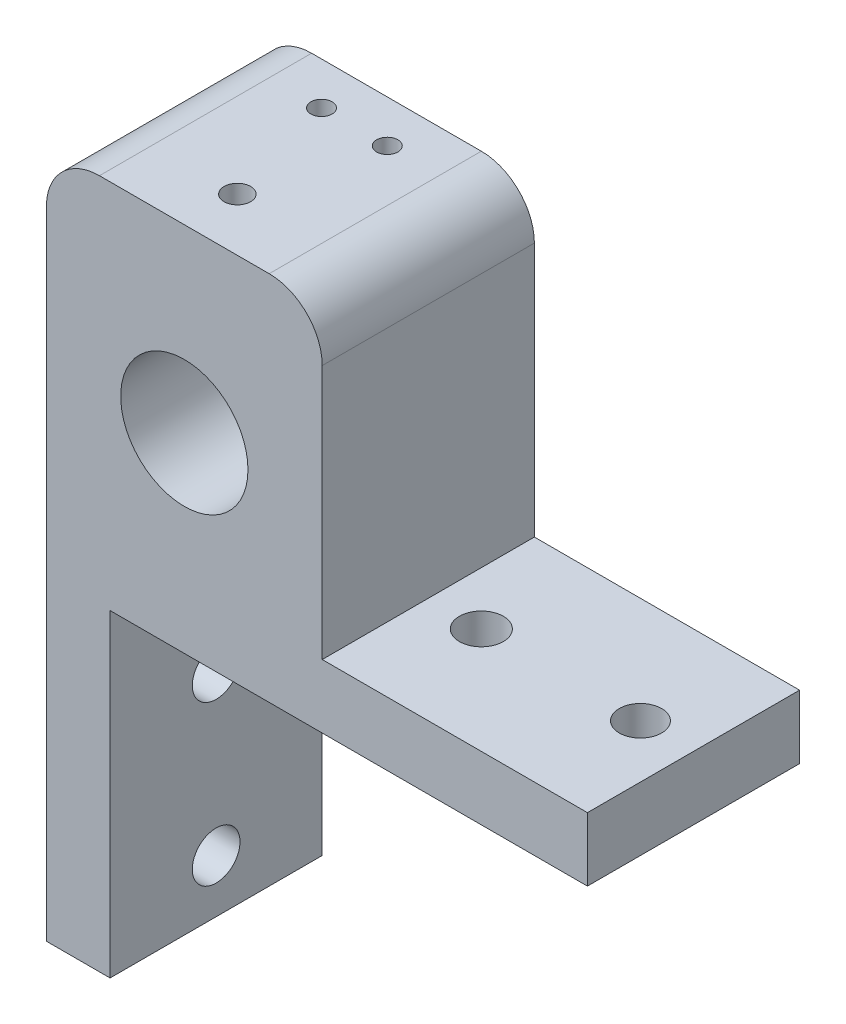
ISO-10303-21;
HEADER;
FILE_DESCRIPTION(('STEP AP214'),'2;1');
FILE_NAME('part.step','',(''),(''),'','','');
FILE_SCHEMA(('AUTOMOTIVE_DESIGN { 1 0 10303 214 1 1 1 1 }'));
ENDSEC;
DATA;
#1=APPLICATION_CONTEXT('core data for automotive mechanical design processes');
#2=APPLICATION_PROTOCOL_DEFINITION('international standard','automotive_design',2000,#1);
#3=PRODUCT_CONTEXT('',#1,'mechanical');
#4=PRODUCT('Part','Part','',(#3));
#5=PRODUCT_RELATED_PRODUCT_CATEGORY('part','',(#4));
#6=PRODUCT_DEFINITION_FORMATION('','',#4);
#7=PRODUCT_DEFINITION_CONTEXT('part definition',#1,'design');
#8=PRODUCT_DEFINITION('design','',#6,#7);
#9=PRODUCT_DEFINITION_SHAPE('','',#8);
#10=(LENGTH_UNIT() NAMED_UNIT(*) SI_UNIT(.MILLI.,.METRE.));
#11=(NAMED_UNIT(*) PLANE_ANGLE_UNIT() SI_UNIT($,.RADIAN.));
#12=(NAMED_UNIT(*) SI_UNIT($,.STERADIAN.) SOLID_ANGLE_UNIT());
#13=UNCERTAINTY_MEASURE_WITH_UNIT(LENGTH_MEASURE(1.E-05),#10,'distance_accuracy_value','');
#14=(GEOMETRIC_REPRESENTATION_CONTEXT(3) GLOBAL_UNCERTAINTY_ASSIGNED_CONTEXT((#13)) GLOBAL_UNIT_ASSIGNED_CONTEXT((#10,
#11,#12)) REPRESENTATION_CONTEXT('',''));
#15=CARTESIAN_POINT('',(0.,0.,0.));
#16=DIRECTION('',(0.,0.,1.));
#17=DIRECTION('',(1.,0.,0.));
#18=AXIS2_PLACEMENT_3D('',#15,#16,#17);
#19=CARTESIAN_POINT('',(0.,0.,-20.));
#20=DIRECTION('',(0.,0.,-1.));
#21=DIRECTION('',(1.,0.,0.));
#22=AXIS2_PLACEMENT_3D('',#19,#20,#21);
#23=PLANE('',#22);
#24=DIRECTION('',(-1.,0.,0.));
#25=VECTOR('',#24,1.);
#26=CARTESIAN_POINT('',(-13.,22.,-20.));
#27=LINE('',#26,#25);
#28=CARTESIAN_POINT('',(7.99999999999999,22.,-20.));
#29=VERTEX_POINT('',#28);
#30=CARTESIAN_POINT('',(-8.,22.,-20.));
#31=VERTEX_POINT('',#30);
#32=EDGE_CURVE('E146',#29,#31,#27,.T.);
#33=ORIENTED_EDGE('',*,*,#32,.F.);
#34=CARTESIAN_POINT('',(8.,17.,-20.));
#35=DIRECTION('',(0.,0.,1.));
#36=DIRECTION('',(1.,0.,0.));
#37=AXIS2_PLACEMENT_3D('',#34,#35,#36);
#38=CIRCLE('',#37,5.);
#39=CARTESIAN_POINT('',(13.,17.,-20.));
#40=VERTEX_POINT('',#39);
#41=EDGE_CURVE('E210',#40,#29,#38,.T.);
#42=ORIENTED_EDGE('',*,*,#41,.F.);
#43=DIRECTION('',(0.,1.,0.));
#44=VECTOR('',#43,1.);
#45=CARTESIAN_POINT('',(13.,22.,-20.));
#46=LINE('',#45,#44);
#47=CARTESIAN_POINT('',(13.,-7.,-20.));
#48=VERTEX_POINT('',#47);
#49=EDGE_CURVE('E141',#48,#40,#46,.T.);
#50=ORIENTED_EDGE('',*,*,#49,.F.);
#51=DIRECTION('',(-1.,0.,0.));
#52=VECTOR('',#51,1.);
#53=CARTESIAN_POINT('',(13.,-7.,-20.));
#54=LINE('',#53,#52);
#55=CARTESIAN_POINT('',(38.,-7.,-20.));
#56=VERTEX_POINT('',#55);
#57=EDGE_CURVE('E139',#56,#48,#54,.T.);
#58=ORIENTED_EDGE('',*,*,#57,.F.);
#59=DIRECTION('',(0.,1.,0.));
#60=VECTOR('',#59,1.);
#61=CARTESIAN_POINT('',(38.,-13.,-20.));
#62=LINE('',#61,#60);
#63=CARTESIAN_POINT('',(38.,-13.,-20.));
#64=VERTEX_POINT('',#63);
#65=EDGE_CURVE('E116',#64,#56,#62,.T.);
#66=ORIENTED_EDGE('',*,*,#65,.F.);
#67=DIRECTION('',(1.,0.,0.));
#68=VECTOR('',#67,1.);
#69=CARTESIAN_POINT('',(13.,-13.,-20.));
#70=LINE('',#69,#68);
#71=CARTESIAN_POINT('',(-7.,-13.,-20.));
#72=VERTEX_POINT('',#71);
#73=EDGE_CURVE('E127',#72,#64,#70,.T.);
#74=ORIENTED_EDGE('',*,*,#73,.F.);
#75=DIRECTION('',(0.,1.,0.));
#76=VECTOR('',#75,1.);
#77=CARTESIAN_POINT('',(-7.,-13.,-20.));
#78=LINE('',#77,#76);
#79=CARTESIAN_POINT('',(-6.99999999999999,-43.,-20.));
#80=VERTEX_POINT('',#79);
#81=EDGE_CURVE('E155',#80,#72,#78,.T.);
#82=ORIENTED_EDGE('',*,*,#81,.F.);
#83=DIRECTION('',(1.,0.,0.));
#84=VECTOR('',#83,1.);
#85=CARTESIAN_POINT('',(-13.,-43.,-20.));
#86=LINE('',#85,#84);
#87=CARTESIAN_POINT('',(-13.,-43.,-20.));
#88=VERTEX_POINT('',#87);
#89=EDGE_CURVE('E152',#88,#80,#86,.T.);
#90=ORIENTED_EDGE('',*,*,#89,.F.);
#91=DIRECTION('',(0.,-1.,0.));
#92=VECTOR('',#91,1.);
#93=CARTESIAN_POINT('',(-13.,22.,-20.));
#94=LINE('',#93,#92);
#95=CARTESIAN_POINT('',(-13.,17.,-20.));
#96=VERTEX_POINT('',#95);
#97=EDGE_CURVE('E149',#96,#88,#94,.T.);
#98=ORIENTED_EDGE('',*,*,#97,.F.);
#99=CARTESIAN_POINT('',(-8.,17.,-20.));
#100=DIRECTION('',(0.,0.,1.));
#101=DIRECTION('',(1.,0.,0.));
#102=AXIS2_PLACEMENT_3D('',#99,#100,#101);
#103=CIRCLE('',#102,5.);
#104=EDGE_CURVE('E43',#31,#96,#103,.T.);
#105=ORIENTED_EDGE('',*,*,#104,.F.);
#106=EDGE_LOOP('',(#33,#42,#50,#58,#66,#74,#82,#90,#98,#105));
#107=FACE_BOUND('',#106,.T.);
#108=CARTESIAN_POINT('',(0.,5.,-20.));
#109=DIRECTION('',(0.,0.,1.));
#110=DIRECTION('',(1.,0.,0.));
#111=AXIS2_PLACEMENT_3D('',#108,#109,#110);
#112=CIRCLE('',#111,6.);
#113=CARTESIAN_POINT('',(6.,5.,-20.));
#114=VERTEX_POINT('',#113);
#115=EDGE_CURVE('E159',#114,#114,#112,.T.);
#116=ORIENTED_EDGE('',*,*,#115,.T.);
#117=EDGE_LOOP('',(#116));
#118=FACE_BOUND('',#117,.T.);
#119=ADVANCED_FACE('F35',(#107,#118),#23,.T.);
#120=CARTESIAN_POINT('',(0.,0.,0.));
#121=DIRECTION('',(0.,0.,-1.));
#122=DIRECTION('',(1.,0.,0.));
#123=AXIS2_PLACEMENT_3D('',#120,#121,#122);
#124=PLANE('',#123);
#125=DIRECTION('',(0.,-1.,0.));
#126=VECTOR('',#125,1.);
#127=CARTESIAN_POINT('',(-13.,-3.99999999999999,0.));
#128=LINE('',#127,#126);
#129=CARTESIAN_POINT('',(-13.,17.,0.));
#130=VERTEX_POINT('',#129);
#131=CARTESIAN_POINT('',(-13.,-43.,0.));
#132=VERTEX_POINT('',#131);
#133=EDGE_CURVE('E168',#130,#132,#128,.T.);
#134=ORIENTED_EDGE('',*,*,#133,.T.);
#135=DIRECTION('',(1.,0.,0.));
#136=VECTOR('',#135,1.);
#137=CARTESIAN_POINT('',(-13.,-43.,0.));
#138=LINE('',#137,#136);
#139=CARTESIAN_POINT('',(-6.99999999999999,-43.,0.));
#140=VERTEX_POINT('',#139);
#141=EDGE_CURVE('E171',#132,#140,#138,.T.);
#142=ORIENTED_EDGE('',*,*,#141,.T.);
#143=DIRECTION('',(0.,1.,0.));
#144=VECTOR('',#143,1.);
#145=CARTESIAN_POINT('',(-7.,-13.,0.));
#146=LINE('',#145,#144);
#147=CARTESIAN_POINT('',(-7.,-13.,0.));
#148=VERTEX_POINT('',#147);
#149=EDGE_CURVE('E174',#140,#148,#146,.T.);
#150=ORIENTED_EDGE('',*,*,#149,.T.);
#151=DIRECTION('',(1.,0.,0.));
#152=VECTOR('',#151,1.);
#153=CARTESIAN_POINT('',(-7.,-13.,0.));
#154=LINE('',#153,#152);
#155=CARTESIAN_POINT('',(38.,-13.,0.));
#156=VERTEX_POINT('',#155);
#157=EDGE_CURVE('E133',#148,#156,#154,.T.);
#158=ORIENTED_EDGE('',*,*,#157,.T.);
#159=DIRECTION('',(0.,1.,0.));
#160=VECTOR('',#159,1.);
#161=CARTESIAN_POINT('',(38.,-13.,0.));
#162=LINE('',#161,#160);
#163=CARTESIAN_POINT('',(38.,-7.,0.));
#164=VERTEX_POINT('',#163);
#165=EDGE_CURVE('E119',#156,#164,#162,.T.);
#166=ORIENTED_EDGE('',*,*,#165,.T.);
#167=DIRECTION('',(-1.,0.,0.));
#168=VECTOR('',#167,1.);
#169=CARTESIAN_POINT('',(13.,-7.,0.));
#170=LINE('',#169,#168);
#171=CARTESIAN_POINT('',(13.,-7.,0.));
#172=VERTEX_POINT('',#171);
#173=EDGE_CURVE('E158',#164,#172,#170,.T.);
#174=ORIENTED_EDGE('',*,*,#173,.T.);
#175=DIRECTION('',(0.,1.,0.));
#176=VECTOR('',#175,1.);
#177=CARTESIAN_POINT('',(13.,22.,0.));
#178=LINE('',#177,#176);
#179=CARTESIAN_POINT('',(13.,17.,0.));
#180=VERTEX_POINT('',#179);
#181=EDGE_CURVE('E162',#172,#180,#178,.T.);
#182=ORIENTED_EDGE('',*,*,#181,.T.);
#183=CARTESIAN_POINT('',(8.,17.,0.));
#184=DIRECTION('',(0.,0.,1.));
#185=DIRECTION('',(1.,0.,0.));
#186=AXIS2_PLACEMENT_3D('',#183,#184,#185);
#187=CIRCLE('',#186,5.);
#188=CARTESIAN_POINT('',(7.99999999999999,22.,0.));
#189=VERTEX_POINT('',#188);
#190=EDGE_CURVE('E203',#189,#180,#187,.F.);
#191=ORIENTED_EDGE('',*,*,#190,.F.);
#192=DIRECTION('',(-1.,0.,0.));
#193=VECTOR('',#192,1.);
#194=CARTESIAN_POINT('',(-13.,22.,0.));
#195=LINE('',#194,#193);
#196=CARTESIAN_POINT('',(-8.,22.,0.));
#197=VERTEX_POINT('',#196);
#198=EDGE_CURVE('E165',#189,#197,#195,.T.);
#199=ORIENTED_EDGE('',*,*,#198,.T.);
#200=CARTESIAN_POINT('',(-8.,17.,0.));
#201=DIRECTION('',(0.,0.,1.));
#202=DIRECTION('',(1.,0.,0.));
#203=AXIS2_PLACEMENT_3D('',#200,#201,#202);
#204=CIRCLE('',#203,5.);
#205=EDGE_CURVE('E205',#130,#197,#204,.F.);
#206=ORIENTED_EDGE('',*,*,#205,.F.);
#207=EDGE_LOOP('',(#134,#142,#150,#158,#166,#174,#182,#191,#199,#206));
#208=FACE_BOUND('',#207,.T.);
#209=CARTESIAN_POINT('',(0.,5.,0.));
#210=DIRECTION('',(0.,0.,1.));
#211=DIRECTION('',(1.,0.,0.));
#212=AXIS2_PLACEMENT_3D('',#209,#210,#211);
#213=CIRCLE('',#212,6.);
#214=CARTESIAN_POINT('',(6.,5.,0.));
#215=VERTEX_POINT('',#214);
#216=EDGE_CURVE('E193',#215,#215,#213,.T.);
#217=ORIENTED_EDGE('',*,*,#216,.F.);
#218=EDGE_LOOP('',(#217));
#219=FACE_BOUND('',#218,.T.);
#220=ADVANCED_FACE('F220',(#208,#219),#124,.F.);
#221=CARTESIAN_POINT('',(38.,-13.,-20.));
#222=DIRECTION('',(-1.,0.,0.));
#223=DIRECTION('',(0.,-1.,0.));
#224=AXIS2_PLACEMENT_3D('',#221,#222,#223);
#225=PLANE('',#224);
#226=ORIENTED_EDGE('',*,*,#165,.F.);
#227=DIRECTION('',(0.,0.,1.));
#228=VECTOR('',#227,1.);
#229=CARTESIAN_POINT('',(38.,-13.,-20.));
#230=LINE('',#229,#228);
#231=EDGE_CURVE('E112',#64,#156,#230,.T.);
#232=ORIENTED_EDGE('',*,*,#231,.F.);
#233=ORIENTED_EDGE('',*,*,#65,.T.);
#234=DIRECTION('',(0.,0.,1.));
#235=VECTOR('',#234,1.);
#236=CARTESIAN_POINT('',(38.,-7.,-20.));
#237=LINE('',#236,#235);
#238=EDGE_CURVE('E124',#56,#164,#237,.T.);
#239=ORIENTED_EDGE('',*,*,#238,.T.);
#240=EDGE_LOOP('',(#226,#232,#233,#239));
#241=FACE_BOUND('',#240,.T.);
#242=ADVANCED_FACE('F114',(#241),#225,.F.);
#243=CARTESIAN_POINT('',(13.,-7.,-20.));
#244=DIRECTION('',(0.,-1.,0.));
#245=DIRECTION('',(0.,0.,1.));
#246=AXIS2_PLACEMENT_3D('',#243,#244,#245);
#247=PLANE('',#246);
#248=CARTESIAN_POINT('',(33.,-7.,-10.));
#249=DIRECTION('',(0.,-1.,0.));
#250=DIRECTION('',(0.,0.,-1.));
#251=AXIS2_PLACEMENT_3D('',#248,#249,#250);
#252=CIRCLE('',#251,2.);
#253=CARTESIAN_POINT('',(33.,-7.,-12.));
#254=VERTEX_POINT('',#253);
#255=EDGE_CURVE('E198',#254,#254,#252,.T.);
#256=ORIENTED_EDGE('',*,*,#255,.T.);
#257=EDGE_LOOP('',(#256));
#258=FACE_BOUND('',#257,.T.);
#259=CARTESIAN_POINT('',(18.,-7.,-10.));
#260=DIRECTION('',(0.,-1.,0.));
#261=DIRECTION('',(0.,0.,-1.));
#262=AXIS2_PLACEMENT_3D('',#259,#260,#261);
#263=CIRCLE('',#262,2.07036437574447);
#264=CARTESIAN_POINT('',(18.,-7.,-12.0703643757445));
#265=VERTEX_POINT('',#264);
#266=EDGE_CURVE('E306',#265,#265,#263,.T.);
#267=ORIENTED_EDGE('',*,*,#266,.T.);
#268=EDGE_LOOP('',(#267));
#269=FACE_BOUND('',#268,.T.);
#270=ORIENTED_EDGE('',*,*,#173,.F.);
#271=ORIENTED_EDGE('',*,*,#238,.F.);
#272=ORIENTED_EDGE('',*,*,#57,.T.);
#273=DIRECTION('',(0.,0.,1.));
#274=VECTOR('',#273,1.);
#275=CARTESIAN_POINT('',(13.,-7.,-20.));
#276=LINE('',#275,#274);
#277=EDGE_CURVE('E183',#48,#172,#276,.T.);
#278=ORIENTED_EDGE('',*,*,#277,.T.);
#279=EDGE_LOOP('',(#270,#271,#272,#278));
#280=FACE_BOUND('',#279,.T.);
#281=ADVANCED_FACE('F232',(#258,#269,#280),#247,.F.);
#282=CARTESIAN_POINT('',(13.,22.,-20.));
#283=DIRECTION('',(-1.,0.,0.));
#284=DIRECTION('',(0.,-1.,0.));
#285=AXIS2_PLACEMENT_3D('',#282,#283,#284);
#286=PLANE('',#285);
#287=ORIENTED_EDGE('',*,*,#181,.F.);
#288=ORIENTED_EDGE('',*,*,#277,.F.);
#289=ORIENTED_EDGE('',*,*,#49,.T.);
#290=DIRECTION('',(0.,0.,1.));
#291=VECTOR('',#290,1.);
#292=CARTESIAN_POINT('',(13.,17.,-20.));
#293=LINE('',#292,#291);
#294=EDGE_CURVE('E11',#180,#40,#293,.F.);
#295=ORIENTED_EDGE('',*,*,#294,.F.);
#296=EDGE_LOOP('',(#287,#288,#289,#295));
#297=FACE_BOUND('',#296,.T.);
#298=ADVANCED_FACE('F230',(#297),#286,.F.);
#299=CARTESIAN_POINT('',(-13.,22.,-20.));
#300=DIRECTION('',(0.,-1.,0.));
#301=DIRECTION('',(0.,0.,1.));
#302=AXIS2_PLACEMENT_3D('',#299,#300,#301);
#303=PLANE('',#302);
#304=CARTESIAN_POINT('',(3.13217874254306,22.,-16.));
#305=DIRECTION('',(0.,-1.,0.));
#306=DIRECTION('',(0.,0.,-1.));
#307=AXIS2_PLACEMENT_3D('',#304,#305,#306);
#308=CIRCLE('',#307,1.);
#309=CARTESIAN_POINT('',(3.13217874254306,22.,-17.));
#310=VERTEX_POINT('',#309);
#311=EDGE_CURVE('E406',#310,#310,#308,.T.);
#312=ORIENTED_EDGE('',*,*,#311,.T.);
#313=EDGE_LOOP('',(#312));
#314=FACE_BOUND('',#313,.T.);
#315=CARTESIAN_POINT('',(-3.06782125745694,22.,-16.));
#316=DIRECTION('',(0.,-1.,0.));
#317=DIRECTION('',(0.,0.,-1.));
#318=AXIS2_PLACEMENT_3D('',#315,#316,#317);
#319=CIRCLE('',#318,1.);
#320=CARTESIAN_POINT('',(-3.06782125745694,22.,-17.));
#321=VERTEX_POINT('',#320);
#322=EDGE_CURVE('E412',#321,#321,#319,.T.);
#323=ORIENTED_EDGE('',*,*,#322,.T.);
#324=EDGE_LOOP('',(#323));
#325=FACE_BOUND('',#324,.T.);
#326=CARTESIAN_POINT('',(0.,22.,-5.));
#327=DIRECTION('',(0.,-1.,0.));
#328=DIRECTION('',(0.,0.,-1.));
#329=AXIS2_PLACEMENT_3D('',#326,#327,#328);
#330=CIRCLE('',#329,1.25);
#331=CARTESIAN_POINT('',(0.,22.,-6.25));
#332=VERTEX_POINT('',#331);
#333=EDGE_CURVE('E309',#332,#332,#330,.T.);
#334=ORIENTED_EDGE('',*,*,#333,.T.);
#335=EDGE_LOOP('',(#334));
#336=FACE_BOUND('',#335,.T.);
#337=ORIENTED_EDGE('',*,*,#198,.F.);
#338=DIRECTION('',(0.,0.,1.));
#339=VECTOR('',#338,1.);
#340=CARTESIAN_POINT('',(8.,22.,-20.));
#341=LINE('',#340,#339);
#342=EDGE_CURVE('E207',#29,#189,#341,.T.);
#343=ORIENTED_EDGE('',*,*,#342,.F.);
#344=ORIENTED_EDGE('',*,*,#32,.T.);
#345=DIRECTION('',(0.,0.,1.));
#346=VECTOR('',#345,1.);
#347=CARTESIAN_POINT('',(-8.,22.,-20.));
#348=LINE('',#347,#346);
#349=EDGE_CURVE('E56',#197,#31,#348,.F.);
#350=ORIENTED_EDGE('',*,*,#349,.F.);
#351=EDGE_LOOP('',(#337,#343,#344,#350));
#352=FACE_BOUND('',#351,.T.);
#353=ADVANCED_FACE('F225',(#314,#325,#336,#352),#303,.F.);
#354=CARTESIAN_POINT('',(-13.,-3.99999999999999,-20.));
#355=DIRECTION('',(1.,0.,0.));
#356=DIRECTION('',(0.,1.,0.));
#357=AXIS2_PLACEMENT_3D('',#354,#355,#356);
#358=PLANE('',#357);
#359=CARTESIAN_POINT('',(-13.,-38.,-10.));
#360=DIRECTION('',(1.,0.,0.));
#361=DIRECTION('',(0.,-1.,0.));
#362=AXIS2_PLACEMENT_3D('',#359,#360,#361);
#363=CIRCLE('',#362,2.25);
#364=CARTESIAN_POINT('',(-13.,-40.25,-10.));
#365=VERTEX_POINT('',#364);
#366=EDGE_CURVE('E190',#365,#365,#363,.T.);
#367=ORIENTED_EDGE('',*,*,#366,.T.);
#368=EDGE_LOOP('',(#367));
#369=FACE_BOUND('',#368,.T.);
#370=CARTESIAN_POINT('',(-13.,-23.,-10.));
#371=DIRECTION('',(1.,0.,0.));
#372=DIRECTION('',(0.,-1.,0.));
#373=AXIS2_PLACEMENT_3D('',#370,#371,#372);
#374=CIRCLE('',#373,2.25);
#375=CARTESIAN_POINT('',(-13.,-25.25,-10.));
#376=VERTEX_POINT('',#375);
#377=EDGE_CURVE('E201',#376,#376,#374,.T.);
#378=ORIENTED_EDGE('',*,*,#377,.T.);
#379=EDGE_LOOP('',(#378));
#380=FACE_BOUND('',#379,.T.);
#381=ORIENTED_EDGE('',*,*,#97,.T.);
#382=DIRECTION('',(0.,0.,1.));
#383=VECTOR('',#382,1.);
#384=CARTESIAN_POINT('',(-13.,-43.,-20.));
#385=LINE('',#384,#383);
#386=EDGE_CURVE('E181',#88,#132,#385,.T.);
#387=ORIENTED_EDGE('',*,*,#386,.T.);
#388=ORIENTED_EDGE('',*,*,#133,.F.);
#389=DIRECTION('',(0.,0.,1.));
#390=VECTOR('',#389,1.);
#391=CARTESIAN_POINT('',(-13.,17.,-20.));
#392=LINE('',#391,#390);
#393=EDGE_CURVE('E123',#96,#130,#392,.T.);
#394=ORIENTED_EDGE('',*,*,#393,.F.);
#395=EDGE_LOOP('',(#381,#387,#388,#394));
#396=FACE_BOUND('',#395,.T.);
#397=ADVANCED_FACE('F216',(#369,#380,#396),#358,.F.);
#398=CARTESIAN_POINT('',(-13.,-43.,-20.));
#399=DIRECTION('',(0.,1.,0.));
#400=DIRECTION('',(0.,0.,-1.));
#401=AXIS2_PLACEMENT_3D('',#398,#399,#400);
#402=PLANE('',#401);
#403=ORIENTED_EDGE('',*,*,#141,.F.);
#404=ORIENTED_EDGE('',*,*,#386,.F.);
#405=ORIENTED_EDGE('',*,*,#89,.T.);
#406=DIRECTION('',(0.,0.,1.));
#407=VECTOR('',#406,1.);
#408=CARTESIAN_POINT('',(-6.99999999999999,-43.,-20.));
#409=LINE('',#408,#407);
#410=EDGE_CURVE('E179',#80,#140,#409,.T.);
#411=ORIENTED_EDGE('',*,*,#410,.T.);
#412=EDGE_LOOP('',(#403,#404,#405,#411));
#413=FACE_BOUND('',#412,.T.);
#414=ADVANCED_FACE('F237',(#413),#402,.F.);
#415=CARTESIAN_POINT('',(-7.,-13.,-20.));
#416=DIRECTION('',(-1.,0.,0.));
#417=DIRECTION('',(0.,-1.,0.));
#418=AXIS2_PLACEMENT_3D('',#415,#416,#417);
#419=PLANE('',#418);
#420=CARTESIAN_POINT('',(-6.99999999999999,-38.,-10.));
#421=DIRECTION('',(1.,0.,0.));
#422=DIRECTION('',(0.,-1.,0.));
#423=AXIS2_PLACEMENT_3D('',#420,#421,#422);
#424=CIRCLE('',#423,2.25);
#425=CARTESIAN_POINT('',(-6.99999999999999,-40.25,-10.));
#426=VERTEX_POINT('',#425);
#427=EDGE_CURVE('E189',#426,#426,#424,.T.);
#428=ORIENTED_EDGE('',*,*,#427,.F.);
#429=EDGE_LOOP('',(#428));
#430=FACE_BOUND('',#429,.T.);
#431=CARTESIAN_POINT('',(-7.,-23.,-10.));
#432=DIRECTION('',(1.,0.,0.));
#433=DIRECTION('',(0.,-1.,0.));
#434=AXIS2_PLACEMENT_3D('',#431,#432,#433);
#435=CIRCLE('',#434,2.25);
#436=CARTESIAN_POINT('',(-7.,-25.25,-10.));
#437=VERTEX_POINT('',#436);
#438=EDGE_CURVE('E186',#437,#437,#435,.T.);
#439=ORIENTED_EDGE('',*,*,#438,.F.);
#440=EDGE_LOOP('',(#439));
#441=FACE_BOUND('',#440,.T.);
#442=ORIENTED_EDGE('',*,*,#149,.F.);
#443=ORIENTED_EDGE('',*,*,#410,.F.);
#444=ORIENTED_EDGE('',*,*,#81,.T.);
#445=DIRECTION('',(0.,0.,1.));
#446=VECTOR('',#445,1.);
#447=CARTESIAN_POINT('',(-7.,-13.,-20.));
#448=LINE('',#447,#446);
#449=EDGE_CURVE('E129',#72,#148,#448,.T.);
#450=ORIENTED_EDGE('',*,*,#449,.T.);
#451=EDGE_LOOP('',(#442,#443,#444,#450));
#452=FACE_BOUND('',#451,.T.);
#453=ADVANCED_FACE('F235',(#430,#441,#452),#419,.F.);
#454=CARTESIAN_POINT('',(-7.,-13.,-20.));
#455=DIRECTION('',(0.,1.,0.));
#456=DIRECTION('',(0.,0.,-1.));
#457=AXIS2_PLACEMENT_3D('',#454,#455,#456);
#458=PLANE('',#457);
#459=CARTESIAN_POINT('',(33.,-13.,-10.));
#460=DIRECTION('',(0.,-1.,0.));
#461=DIRECTION('',(0.,0.,-1.));
#462=AXIS2_PLACEMENT_3D('',#459,#460,#461);
#463=CIRCLE('',#462,2.);
#464=CARTESIAN_POINT('',(33.,-13.,-12.));
#465=VERTEX_POINT('',#464);
#466=EDGE_CURVE('E197',#465,#465,#463,.T.);
#467=ORIENTED_EDGE('',*,*,#466,.F.);
#468=EDGE_LOOP('',(#467));
#469=FACE_BOUND('',#468,.T.);
#470=CARTESIAN_POINT('',(18.,-13.,-10.));
#471=DIRECTION('',(0.,-1.,0.));
#472=DIRECTION('',(0.,0.,-1.));
#473=AXIS2_PLACEMENT_3D('',#470,#471,#472);
#474=CIRCLE('',#473,2.07036437574447);
#475=CARTESIAN_POINT('',(18.,-13.,-12.0703643757445));
#476=VERTEX_POINT('',#475);
#477=EDGE_CURVE('E194',#476,#476,#474,.T.);
#478=ORIENTED_EDGE('',*,*,#477,.F.);
#479=EDGE_LOOP('',(#478));
#480=FACE_BOUND('',#479,.T.);
#481=ORIENTED_EDGE('',*,*,#157,.F.);
#482=ORIENTED_EDGE('',*,*,#449,.F.);
#483=ORIENTED_EDGE('',*,*,#73,.T.);
#484=ORIENTED_EDGE('',*,*,#231,.T.);
#485=EDGE_LOOP('',(#481,#482,#483,#484));
#486=FACE_BOUND('',#485,.T.);
#487=ADVANCED_FACE('F128',(#469,#480,#486),#458,.F.);
#488=CARTESIAN_POINT('',(0.,5.,-20.));
#489=DIRECTION('',(0.,0.,1.));
#490=DIRECTION('',(-1.,0.,0.));
#491=AXIS2_PLACEMENT_3D('',#488,#489,#490);
#492=CYLINDRICAL_SURFACE('',#491,6.);
#493=CARTESIAN_POINT('',(0.,11.,-6.25));
#494=CARTESIAN_POINT('',(0.0694090417016607,10.9999987152665,-6.24999752253078));
#495=CARTESIAN_POINT('',(0.138848789520876,10.9987832877504,-6.24419933428125));
#496=CARTESIAN_POINT('',(0.275761316266993,10.9940520099068,-6.22118065046715));
#497=CARTESIAN_POINT('',(0.343232560128313,10.9905344118925,-6.20395147696307));
#498=CARTESIAN_POINT('',(0.474209132291342,10.981591091962,-6.15862954507818));
#499=CARTESIAN_POINT('',(0.537718336709185,10.9761672705265,-6.13054760400111));
#500=CARTESIAN_POINT('',(0.659120328605959,10.9639992780986,-6.06435039114382));
#501=CARTESIAN_POINT('',(0.717013367534327,10.9572551662597,-6.02623556884417));
#502=CARTESIAN_POINT('',(0.826390324308838,10.9430770002465,-5.94046365980936));
#503=CARTESIAN_POINT('',(0.877780244162686,10.9356350584853,-5.89268799876492));
#504=CARTESIAN_POINT('',(0.971877776769394,10.9209565769245,-5.78920534080489));
#505=CARTESIAN_POINT('',(1.01458467096099,10.9137200541668,-5.73349768812774));
#506=CARTESIAN_POINT('',(1.09051031677217,10.9001944259531,-5.61504803123384));
#507=CARTESIAN_POINT('',(1.12363054680651,10.8939154517483,-5.55224161549726));
#508=CARTESIAN_POINT('',(1.17881119348064,10.8831284065002,-5.42180254822724));
#509=CARTESIAN_POINT('',(1.20087280167641,10.8786201446757,-5.35417041755746));
#510=CARTESIAN_POINT('',(1.23300240133737,10.8719650098612,-5.21701476258436));
#511=CARTESIAN_POINT('',(1.24323597696799,10.8697855685587,-5.14753164066523));
#512=CARTESIAN_POINT('',(1.25193357655615,10.8679369071649,-5.00780315713737));
#513=CARTESIAN_POINT('',(1.25039890894687,10.8682674080098,-4.9375578811347));
#514=CARTESIAN_POINT('',(1.23573719037197,10.8713717431917,-4.79951897202482));
#515=CARTESIAN_POINT('',(1.2228010523272,10.874105336799,-4.73170402033879));
#516=CARTESIAN_POINT('',(1.18600543529945,10.8816443761594,-4.59922849035507));
#517=CARTESIAN_POINT('',(1.16214539481382,10.8864499284132,-4.53456807439367));
#518=CARTESIAN_POINT('',(1.10400003213928,10.897631914641,-4.40969277158402));
#519=CARTESIAN_POINT('',(1.06964002534237,10.9040195378559,-4.34951370347293));
#520=CARTESIAN_POINT('',(0.991522699274819,10.9176389001072,-4.23570425573184));
#521=CARTESIAN_POINT('',(0.947764212262589,10.9248707439854,-4.18207469116402));
#522=CARTESIAN_POINT('',(0.851074921546784,10.9395373092991,-4.08178603891963));
#523=CARTESIAN_POINT('',(0.797981433412083,10.9469732319947,-4.03528383110299));
#524=CARTESIAN_POINT('',(0.684667288611798,10.96108088143,-3.95181955777103));
#525=CARTESIAN_POINT('',(0.624446525025766,10.9677525967024,-3.9148576354016));
#526=CARTESIAN_POINT('',(0.498405541235479,10.9795987094281,-3.85148991846405));
#527=CARTESIAN_POINT('',(0.4325754619265,10.9847703971026,-3.82510319543288));
#528=CARTESIAN_POINT('',(0.297284620972155,10.9930133821128,-3.78380829516451));
#529=CARTESIAN_POINT('',(0.22782433859509,10.9960849559605,-3.7688986067686));
#530=CARTESIAN_POINT('',(0.0885918657008355,10.9997427521546,-3.75120574793211));
#531=CARTESIAN_POINT('',(0.018848055526179,11.0003729353758,-3.74820805850575));
#532=CARTESIAN_POINT('',(-0.120143798757714,10.9991995225277,-3.7538449499691));
#533=CARTESIAN_POINT('',(-0.189391872962258,10.9973960754815,-3.7624788186016));
#534=CARTESIAN_POINT('',(-0.324726367119814,10.9915856497918,-3.79095565346953));
#535=CARTESIAN_POINT('',(-0.390837192894207,10.9876005286808,-3.81068748538347));
#536=CARTESIAN_POINT('',(-0.518811446661332,10.9778722724239,-3.86067786042141));
#537=CARTESIAN_POINT('',(-0.580674536336776,10.9721289974458,-3.89093724086598));
#538=CARTESIAN_POINT('',(-0.699294306943495,10.9594124149071,-3.96158037823756));
#539=CARTESIAN_POINT('',(-0.755973219469835,10.9524239381233,-4.00209192956906));
#540=CARTESIAN_POINT('',(-0.861805445886521,10.9380256829971,-4.09191956307627));
#541=CARTESIAN_POINT('',(-0.910957877913286,10.9306158554251,-4.14123667551894));
#542=CARTESIAN_POINT('',(-1.0011786486518,10.9160602453138,-4.2482555769997));
#543=CARTESIAN_POINT('',(-1.04209914600204,10.908920893075,-4.30608303195528));
#544=CARTESIAN_POINT('',(-1.11364719079244,10.8958560101581,-4.42791628421379));
#545=CARTESIAN_POINT('',(-1.14427516677864,10.8899304289465,-4.49192182413911));
#546=CARTESIAN_POINT('',(-1.19417246443922,10.8800170070804,-4.62396119629823));
#547=CARTESIAN_POINT('',(-1.21350309828032,10.8760187278469,-4.69197103716584));
#548=CARTESIAN_POINT('',(-1.24044038523407,10.870391847097,-4.83036655049226));
#549=CARTESIAN_POINT('',(-1.24804871544441,10.8687629066037,-4.90075188161944));
#550=CARTESIAN_POINT('',(-1.25125926487611,10.8680790730851,-5.04041340099965));
#551=CARTESIAN_POINT('',(-1.24709542622726,10.868974023215,-5.10968407022205));
#552=CARTESIAN_POINT('',(-1.22739905314032,10.8731244725493,-5.24651400892022));
#553=CARTESIAN_POINT('',(-1.21186662782266,10.8763799490963,-5.31407329481611));
#554=CARTESIAN_POINT('',(-1.16998217768585,10.8848613244772,-5.44539777189066));
#555=CARTESIAN_POINT('',(-1.14366117568421,10.8900815700793,-5.50917324648693));
#556=CARTESIAN_POINT('',(-1.08097457299757,10.9019070573874,-5.63143877602667));
#557=CARTESIAN_POINT('',(-1.0446080398303,10.9085124276546,-5.68992833963313));
#558=CARTESIAN_POINT('',(-0.962073695342412,10.9225157955115,-5.80112162707945));
#559=CARTESIAN_POINT('',(-0.915737890418227,10.929926138684,-5.85369912456499));
#560=CARTESIAN_POINT('',(-0.814924438115335,10.9446183958321,-5.95040949322636));
#561=CARTESIAN_POINT('',(-0.760444918832969,10.9519002798488,-5.99454041755149));
#562=CARTESIAN_POINT('',(-0.644134427507704,10.9656144454764,-6.07358857318406));
#563=CARTESIAN_POINT('',(-0.582225921521349,10.9720359607324,-6.10839367988629));
#564=CARTESIAN_POINT('',(-0.453319843998454,10.9831990849409,-6.16705022843002));
#565=CARTESIAN_POINT('',(-0.386326781907244,10.987942161821,-6.19091124718188));
#566=CARTESIAN_POINT('',(-0.266015292900106,10.9943249978144,-6.22254027828843));
#567=CARTESIAN_POINT('',(-0.21336759372793,10.9964403566139,-6.23281876320886));
#568=CARTESIAN_POINT('',(-0.107152674176537,10.9992783278976,-6.24654945427733));
#569=CARTESIAN_POINT('',(-0.0535854878488721,11.0000009918459,-6.25000191266719));
#570=CARTESIAN_POINT('',(0.,11.,-6.25));
#571=B_SPLINE_CURVE_WITH_KNOTS('',3,(#493,#494,#495,#496,#497,#498,#499,#500,#501,#502,#503,
#504,#505,#506,#507,#508,#509,#510,#511,#512,#513,#514,#515,#516,#517,#518,#519,#520,#521,#522,
#523,#524,#525,#526,#527,#528,#529,#530,#531,#532,#533,#534,#535,#536,#537,#538,#539,#540,#541,
#542,#543,#544,#545,#546,#547,#548,#549,#550,#551,#552,#553,#554,#555,#556,#557,#558,#559,#560,
#561,#562,#563,#564,#565,#566,#567,#568,#569,#570),.UNSPECIFIED.,.T.,.F.,(4,2,2,2,2,2,2,2,2,2,2,
2,2,2,2,2,2,2,2,2,2,2,2,2,2,2,2,2,2,2,2,2,2,2,2,2,2,2,4),(0.,0.208031045103183,
0.416220199906225,0.624202378825443,0.832175241572991,1.04287526388123,1.25359271551786,
1.46640449178549,1.6791933328549,1.88896575169854,2.09871484767165,2.3050171212906,
2.5113300003028,2.71914592416749,2.92698768368035,3.13889526355466,3.35080602278218,
3.56309724499663,3.77536051045772,3.98378339407676,4.19219351552278,4.39855286632622,
4.60492863390934,4.81401583995737,5.02312752564574,5.23571263829337,5.4482888985131,
5.65970050095025,5.87108185414185,6.07829223291039,6.28550062281362,6.49211731393256,
6.6987531908148,6.9091902483031,7.1196757511737,7.33258864398257,7.54531486464974,
7.7059258847728,7.86653096973392),.UNSPECIFIED.);
#572=CARTESIAN_POINT('',(0.,11.,-6.25));
#573=VERTEX_POINT('',#572);
#574=EDGE_CURVE('E312',#573,#573,#571,.T.);
#575=ORIENTED_EDGE('',*,*,#574,.F.);
#576=EDGE_LOOP('',(#575));
#577=FACE_BOUND('',#576,.T.);
#578=ORIENTED_EDGE('',*,*,#115,.F.);
#579=EDGE_LOOP('',(#578));
#580=FACE_BOUND('',#579,.T.);
#581=ORIENTED_EDGE('',*,*,#216,.T.);
#582=EDGE_LOOP('',(#581));
#583=FACE_BOUND('',#582,.T.);
#584=ADVANCED_FACE('F255',(#577,#580,#583),#492,.F.);
#585=CARTESIAN_POINT('',(7.,-23.,-10.));
#586=DIRECTION('',(-1.,0.,0.));
#587=DIRECTION('',(0.,-1.,0.));
#588=AXIS2_PLACEMENT_3D('',#585,#586,#587);
#589=CYLINDRICAL_SURFACE('',#588,2.25);
#590=ORIENTED_EDGE('',*,*,#377,.F.);
#591=EDGE_LOOP('',(#590));
#592=FACE_BOUND('',#591,.T.);
#593=ORIENTED_EDGE('',*,*,#438,.T.);
#594=EDGE_LOOP('',(#593));
#595=FACE_BOUND('',#594,.T.);
#596=ADVANCED_FACE('F263',(#592,#595),#589,.F.);
#597=CARTESIAN_POINT('',(7.,-38.,-10.));
#598=DIRECTION('',(-1.,0.,0.));
#599=DIRECTION('',(0.,-1.,0.));
#600=AXIS2_PLACEMENT_3D('',#597,#598,#599);
#601=CYLINDRICAL_SURFACE('',#600,2.25);
#602=ORIENTED_EDGE('',*,*,#366,.F.);
#603=EDGE_LOOP('',(#602));
#604=FACE_BOUND('',#603,.T.);
#605=ORIENTED_EDGE('',*,*,#427,.T.);
#606=EDGE_LOOP('',(#605));
#607=FACE_BOUND('',#606,.T.);
#608=ADVANCED_FACE('F272',(#604,#607),#601,.F.);
#609=CARTESIAN_POINT('',(18.,-27.,-10.));
#610=DIRECTION('',(0.,1.,0.));
#611=DIRECTION('',(0.,0.,-1.));
#612=AXIS2_PLACEMENT_3D('',#609,#610,#611);
#613=CYLINDRICAL_SURFACE('',#612,2.07036437574447);
#614=ORIENTED_EDGE('',*,*,#266,.F.);
#615=EDGE_LOOP('',(#614));
#616=FACE_BOUND('',#615,.T.);
#617=ORIENTED_EDGE('',*,*,#477,.T.);
#618=EDGE_LOOP('',(#617));
#619=FACE_BOUND('',#618,.T.);
#620=ADVANCED_FACE('F269',(#616,#619),#613,.F.);
#621=CARTESIAN_POINT('',(33.,-27.,-10.));
#622=DIRECTION('',(0.,1.,0.));
#623=DIRECTION('',(0.,0.,-1.));
#624=AXIS2_PLACEMENT_3D('',#621,#622,#623);
#625=CYLINDRICAL_SURFACE('',#624,2.);
#626=ORIENTED_EDGE('',*,*,#255,.F.);
#627=EDGE_LOOP('',(#626));
#628=FACE_BOUND('',#627,.T.);
#629=ORIENTED_EDGE('',*,*,#466,.T.);
#630=EDGE_LOOP('',(#629));
#631=FACE_BOUND('',#630,.T.);
#632=ADVANCED_FACE('F271',(#628,#631),#625,.F.);
#633=CARTESIAN_POINT('',(-8.,17.,-20.));
#634=DIRECTION('',(0.,0.,1.));
#635=DIRECTION('',(-1.,0.,0.));
#636=AXIS2_PLACEMENT_3D('',#633,#634,#635);
#637=CYLINDRICAL_SURFACE('',#636,5.);
#638=ORIENTED_EDGE('',*,*,#104,.T.);
#639=ORIENTED_EDGE('',*,*,#393,.T.);
#640=ORIENTED_EDGE('',*,*,#205,.T.);
#641=ORIENTED_EDGE('',*,*,#349,.T.);
#642=EDGE_LOOP('',(#638,#639,#640,#641));
#643=FACE_BOUND('',#642,.T.);
#644=ADVANCED_FACE('F212',(#643),#637,.T.);
#645=CARTESIAN_POINT('',(8.,17.,-20.));
#646=DIRECTION('',(0.,0.,1.));
#647=DIRECTION('',(-1.,0.,0.));
#648=AXIS2_PLACEMENT_3D('',#645,#646,#647);
#649=CYLINDRICAL_SURFACE('',#648,5.);
#650=ORIENTED_EDGE('',*,*,#41,.T.);
#651=ORIENTED_EDGE('',*,*,#342,.T.);
#652=ORIENTED_EDGE('',*,*,#190,.T.);
#653=ORIENTED_EDGE('',*,*,#294,.T.);
#654=EDGE_LOOP('',(#650,#651,#652,#653));
#655=FACE_BOUND('',#654,.T.);
#656=ADVANCED_FACE('F37',(#655),#649,.T.);
#657=CARTESIAN_POINT('',(0.,-43.001,-5.));
#658=DIRECTION('',(0.,1.,0.));
#659=DIRECTION('',(0.,0.,-1.));
#660=AXIS2_PLACEMENT_3D('',#657,#658,#659);
#661=CYLINDRICAL_SURFACE('',#660,1.25);
#662=ORIENTED_EDGE('',*,*,#574,.T.);
#663=EDGE_LOOP('',(#662));
#664=FACE_BOUND('',#663,.T.);
#665=ORIENTED_EDGE('',*,*,#333,.F.);
#666=EDGE_LOOP('',(#665));
#667=FACE_BOUND('',#666,.T.);
#668=ADVANCED_FACE('F322',(#664,#667),#661,.F.);
#669=CARTESIAN_POINT('',(-3.06782125745694,12.,-16.));
#670=DIRECTION('',(0.,1.,0.));
#671=DIRECTION('',(0.,0.,-1.));
#672=AXIS2_PLACEMENT_3D('',#669,#670,#671);
#673=CYLINDRICAL_SURFACE('',#672,1.);
#674=CARTESIAN_POINT('',(-3.06782125745694,12.,-16.));
#675=DIRECTION('',(0.,-1.,0.));
#676=DIRECTION('',(0.,0.,-1.));
#677=AXIS2_PLACEMENT_3D('',#674,#675,#676);
#678=CIRCLE('',#677,1.);
#679=CARTESIAN_POINT('',(-3.06782125745694,12.,-17.));
#680=VERTEX_POINT('',#679);
#681=EDGE_CURVE('E408',#680,#680,#678,.T.);
#682=ORIENTED_EDGE('',*,*,#681,.T.);
#683=EDGE_LOOP('',(#682));
#684=FACE_BOUND('',#683,.T.);
#685=ORIENTED_EDGE('',*,*,#322,.F.);
#686=EDGE_LOOP('',(#685));
#687=FACE_BOUND('',#686,.T.);
#688=ADVANCED_FACE('F325',(#684,#687),#673,.F.);
#689=CARTESIAN_POINT('',(-3.06782125745694,12.,-16.));
#690=DIRECTION('',(0.,1.,0.));
#691=DIRECTION('',(0.,0.,-1.));
#692=AXIS2_PLACEMENT_3D('',#689,#690,#691);
#693=PLANE('',#692);
#694=ORIENTED_EDGE('',*,*,#681,.F.);
#695=EDGE_LOOP('',(#694));
#696=FACE_BOUND('',#695,.T.);
#697=ADVANCED_FACE('F331',(#696),#693,.T.);
#698=CARTESIAN_POINT('',(3.13217874254306,12.,-16.));
#699=DIRECTION('',(0.,1.,0.));
#700=DIRECTION('',(0.,0.,-1.));
#701=AXIS2_PLACEMENT_3D('',#698,#699,#700);
#702=CYLINDRICAL_SURFACE('',#701,1.);
#703=CARTESIAN_POINT('',(3.13217874254306,12.,-16.));
#704=DIRECTION('',(0.,-1.,0.));
#705=DIRECTION('',(0.,0.,-1.));
#706=AXIS2_PLACEMENT_3D('',#703,#704,#705);
#707=CIRCLE('',#706,1.);
#708=CARTESIAN_POINT('',(3.13217874254306,12.,-17.));
#709=VERTEX_POINT('',#708);
#710=EDGE_CURVE('E318',#709,#709,#707,.T.);
#711=ORIENTED_EDGE('',*,*,#710,.T.);
#712=EDGE_LOOP('',(#711));
#713=FACE_BOUND('',#712,.T.);
#714=ORIENTED_EDGE('',*,*,#311,.F.);
#715=EDGE_LOOP('',(#714));
#716=FACE_BOUND('',#715,.T.);
#717=ADVANCED_FACE('F380',(#713,#716),#702,.F.);
#718=CARTESIAN_POINT('',(3.13217874254306,12.,-16.));
#719=DIRECTION('',(0.,1.,0.));
#720=DIRECTION('',(0.,0.,-1.));
#721=AXIS2_PLACEMENT_3D('',#718,#719,#720);
#722=PLANE('',#721);
#723=ORIENTED_EDGE('',*,*,#710,.F.);
#724=EDGE_LOOP('',(#723));
#725=FACE_BOUND('',#724,.T.);
#726=ADVANCED_FACE('F390',(#725),#722,.T.);
#727=CLOSED_SHELL('',(#119,#220,#242,#281,#298,#353,#397,#414,#453,#487,#584,#596,#608,#620,
#632,#644,#656,#668,#688,#697,#717,#726));
#728=MANIFOLD_SOLID_BREP('B2',#727);
#729=ADVANCED_BREP_SHAPE_REPRESENTATION('',(#18,#728),#14);
#730=SHAPE_DEFINITION_REPRESENTATION(#9,#729);
ENDSEC;
END-ISO-10303-21;
